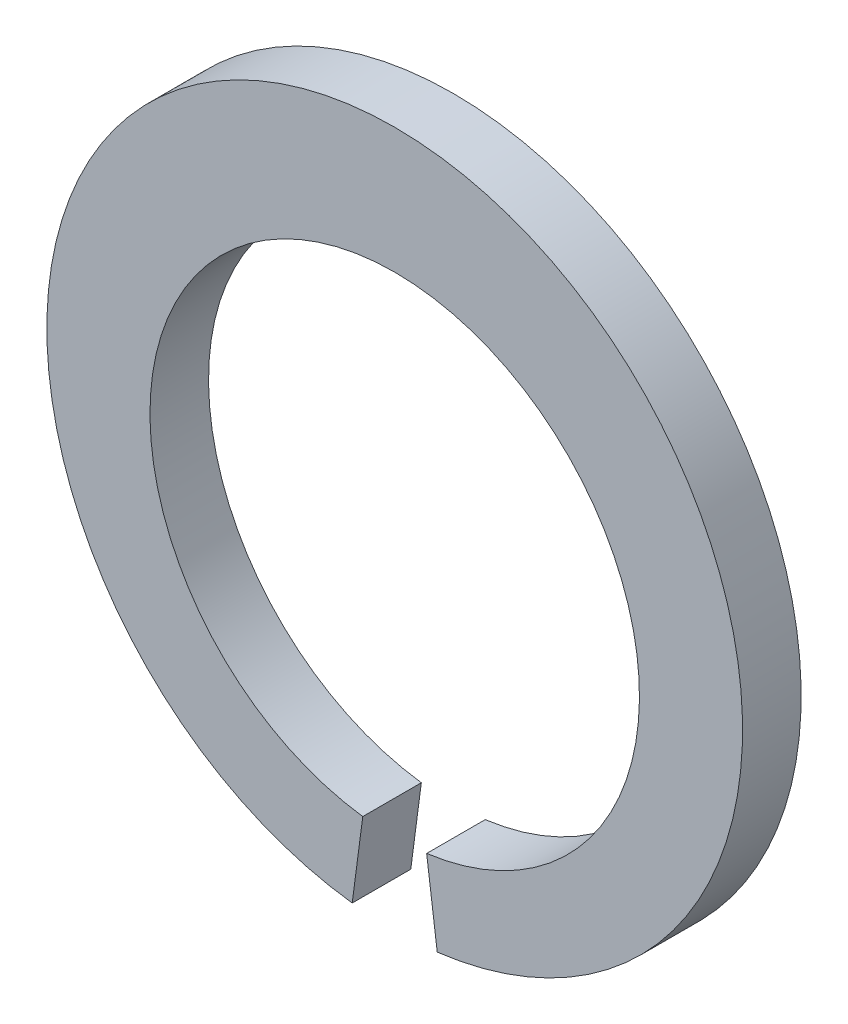
ISO-10303-21;
HEADER;
FILE_DESCRIPTION(('STEP AP214'),'2;1');
FILE_NAME('part.step','',(''),(''),'','','');
FILE_SCHEMA(('AUTOMOTIVE_DESIGN { 1 0 10303 214 1 1 1 1 }'));
ENDSEC;
DATA;
#1=APPLICATION_CONTEXT('core data for automotive mechanical design processes');
#2=APPLICATION_PROTOCOL_DEFINITION('international standard','automotive_design',2000,#1);
#3=PRODUCT_CONTEXT('',#1,'mechanical');
#4=PRODUCT('Part','Part','',(#3));
#5=PRODUCT_RELATED_PRODUCT_CATEGORY('part','',(#4));
#6=PRODUCT_DEFINITION_FORMATION('','',#4);
#7=PRODUCT_DEFINITION_CONTEXT('part definition',#1,'design');
#8=PRODUCT_DEFINITION('design','',#6,#7);
#9=PRODUCT_DEFINITION_SHAPE('','',#8);
#10=(LENGTH_UNIT() NAMED_UNIT(*) SI_UNIT(.MILLI.,.METRE.));
#11=(NAMED_UNIT(*) PLANE_ANGLE_UNIT() SI_UNIT($,.RADIAN.));
#12=(NAMED_UNIT(*) SI_UNIT($,.STERADIAN.) SOLID_ANGLE_UNIT());
#13=UNCERTAINTY_MEASURE_WITH_UNIT(LENGTH_MEASURE(1.E-05),#10,'distance_accuracy_value','');
#14=(GEOMETRIC_REPRESENTATION_CONTEXT(3) GLOBAL_UNCERTAINTY_ASSIGNED_CONTEXT((#13)) GLOBAL_UNIT_ASSIGNED_CONTEXT((#10,
#11,#12)) REPRESENTATION_CONTEXT('',''));
#15=CARTESIAN_POINT('',(0.,0.,0.));
#16=DIRECTION('',(0.,0.,1.));
#17=DIRECTION('',(1.,0.,0.));
#18=AXIS2_PLACEMENT_3D('',#15,#16,#17);
#19=CARTESIAN_POINT('',(0.,0.,-1.0668));
#20=DIRECTION('',(0.,0.,1.));
#21=DIRECTION('',(1.,0.,0.));
#22=AXIS2_PLACEMENT_3D('',#19,#20,#21);
#23=CYLINDRICAL_SURFACE('',#22,4.4577);
#24=CARTESIAN_POINT('',(0.,0.,0.));
#25=DIRECTION('',(0.,0.,-1.));
#26=DIRECTION('',(1.,0.,0.));
#27=AXIS2_PLACEMENT_3D('',#24,#25,#26);
#28=CIRCLE('',#27,4.4577);
#29=CARTESIAN_POINT('',(-0.581846607059326,-4.41956375854603,0.));
#30=VERTEX_POINT('',#29);
#31=CARTESIAN_POINT('',(0.581846607059326,-4.41956375854603,0.));
#32=VERTEX_POINT('',#31);
#33=EDGE_CURVE('E96',#30,#32,#28,.T.);
#34=ORIENTED_EDGE('',*,*,#33,.F.);
#35=DIRECTION('',(0.,0.,1.));
#36=VECTOR('',#35,1.);
#37=CARTESIAN_POINT('',(-0.581846607059326,-4.41956375854603,-1.0668));
#38=LINE('',#37,#36);
#39=CARTESIAN_POINT('',(-0.581846607059326,-4.41956375854603,-1.0668));
#40=VERTEX_POINT('',#39);
#41=EDGE_CURVE('E11',#40,#30,#38,.T.);
#42=ORIENTED_EDGE('',*,*,#41,.F.);
#43=CARTESIAN_POINT('',(0.,0.,-1.0668));
#44=DIRECTION('',(0.,0.,-1.));
#45=DIRECTION('',(1.,0.,0.));
#46=AXIS2_PLACEMENT_3D('',#43,#44,#45);
#47=CIRCLE('',#46,4.4577);
#48=CARTESIAN_POINT('',(0.581846607059326,-4.41956375854603,-1.0668));
#49=VERTEX_POINT('',#48);
#50=EDGE_CURVE('E90',#40,#49,#47,.T.);
#51=ORIENTED_EDGE('',*,*,#50,.T.);
#52=DIRECTION('',(0.,0.,1.));
#53=VECTOR('',#52,1.);
#54=CARTESIAN_POINT('',(0.581846607059326,-4.41956375854603,-1.0668));
#55=LINE('',#54,#53);
#56=EDGE_CURVE('E35',#49,#32,#55,.T.);
#57=ORIENTED_EDGE('',*,*,#56,.T.);
#58=EDGE_LOOP('',(#34,#42,#51,#57));
#59=FACE_BOUND('',#58,.T.);
#60=ADVANCED_FACE('F32',(#59),#23,.F.);
#61=CARTESIAN_POINT('',(-0.581846607059326,-4.41956375854603,-1.0668));
#62=DIRECTION('',(0.99144486137381,-0.130526192220052,0.));
#63=DIRECTION('',(0.130526192220052,0.99144486137381,0.));
#64=AXIS2_PLACEMENT_3D('',#61,#62,#63);
#65=PLANE('',#64);
#66=DIRECTION('',(0.130526192220052,0.99144486137381,0.));
#67=VECTOR('',#66,1.);
#68=CARTESIAN_POINT('',(-0.581846607059326,-4.41956375854603,0.));
#69=LINE('',#68,#67);
#70=CARTESIAN_POINT('',(-0.774137793437907,-5.88016032832193,0.));
#71=VERTEX_POINT('',#70);
#72=EDGE_CURVE('E92',#71,#30,#69,.T.);
#73=ORIENTED_EDGE('',*,*,#72,.F.);
#74=DIRECTION('',(0.,0.,1.));
#75=VECTOR('',#74,1.);
#76=CARTESIAN_POINT('',(-0.774137793437907,-5.88016032832193,-1.0668));
#77=LINE('',#76,#75);
#78=CARTESIAN_POINT('',(-0.774137793437907,-5.88016032832193,-1.0668));
#79=VERTEX_POINT('',#78);
#80=EDGE_CURVE('E41',#79,#71,#77,.T.);
#81=ORIENTED_EDGE('',*,*,#80,.F.);
#82=DIRECTION('',(0.130526192220052,0.99144486137381,0.));
#83=VECTOR('',#82,1.);
#84=CARTESIAN_POINT('',(-0.581846607059326,-4.41956375854603,-1.0668));
#85=LINE('',#84,#83);
#86=EDGE_CURVE('E87',#79,#40,#85,.T.);
#87=ORIENTED_EDGE('',*,*,#86,.T.);
#88=ORIENTED_EDGE('',*,*,#41,.T.);
#89=EDGE_LOOP('',(#73,#81,#87,#88));
#90=FACE_BOUND('',#89,.T.);
#91=ADVANCED_FACE('F106',(#90),#65,.T.);
#92=CARTESIAN_POINT('',(0.,0.408033462509381,-1.0668));
#93=DIRECTION('',(0.,0.,1.));
#94=DIRECTION('',(1.,0.,0.));
#95=AXIS2_PLACEMENT_3D('',#92,#93,#94);
#96=CYLINDRICAL_SURFACE('',#95,6.33566653749062);
#97=CARTESIAN_POINT('',(0.,0.408033462509381,0.));
#98=DIRECTION('',(0.,0.,1.));
#99=DIRECTION('',(1.,0.,0.));
#100=AXIS2_PLACEMENT_3D('',#97,#98,#99);
#101=CIRCLE('',#100,6.33566653749062);
#102=CARTESIAN_POINT('',(0.774137793437907,-5.88016032832193,0.));
#103=VERTEX_POINT('',#102);
#104=EDGE_CURVE('E82',#103,#71,#101,.T.);
#105=ORIENTED_EDGE('',*,*,#104,.F.);
#106=DIRECTION('',(0.,0.,1.));
#107=VECTOR('',#106,1.);
#108=CARTESIAN_POINT('',(0.774137793437907,-5.88016032832193,-1.0668));
#109=LINE('',#108,#107);
#110=CARTESIAN_POINT('',(0.774137793437907,-5.88016032832193,-1.0668));
#111=VERTEX_POINT('',#110);
#112=EDGE_CURVE('E77',#111,#103,#109,.T.);
#113=ORIENTED_EDGE('',*,*,#112,.F.);
#114=CARTESIAN_POINT('',(0.,0.408033462509381,-1.0668));
#115=DIRECTION('',(0.,0.,1.));
#116=DIRECTION('',(1.,0.,0.));
#117=AXIS2_PLACEMENT_3D('',#114,#115,#116);
#118=CIRCLE('',#117,6.33566653749062);
#119=EDGE_CURVE('E80',#111,#79,#118,.T.);
#120=ORIENTED_EDGE('',*,*,#119,.T.);
#121=ORIENTED_EDGE('',*,*,#80,.T.);
#122=EDGE_LOOP('',(#105,#113,#120,#121));
#123=FACE_BOUND('',#122,.T.);
#124=ADVANCED_FACE('F79',(#123),#96,.T.);
#125=CARTESIAN_POINT('',(0.581846607059326,-4.41956375854603,-1.0668));
#126=DIRECTION('',(-0.99144486137381,-0.130526192220052,0.));
#127=DIRECTION('',(0.130526192220052,-0.99144486137381,0.));
#128=AXIS2_PLACEMENT_3D('',#125,#126,#127);
#129=PLANE('',#128);
#130=DIRECTION('',(0.130526192220052,-0.99144486137381,0.));
#131=VECTOR('',#130,1.);
#132=CARTESIAN_POINT('',(0.581846607059326,-4.41956375854603,0.));
#133=LINE('',#132,#131);
#134=EDGE_CURVE('E99',#32,#103,#133,.T.);
#135=ORIENTED_EDGE('',*,*,#134,.F.);
#136=ORIENTED_EDGE('',*,*,#56,.F.);
#137=DIRECTION('',(0.130526192220052,-0.99144486137381,0.));
#138=VECTOR('',#137,1.);
#139=CARTESIAN_POINT('',(0.581846607059326,-4.41956375854603,-1.0668));
#140=LINE('',#139,#138);
#141=EDGE_CURVE('E86',#49,#111,#140,.T.);
#142=ORIENTED_EDGE('',*,*,#141,.T.);
#143=ORIENTED_EDGE('',*,*,#112,.T.);
#144=EDGE_LOOP('',(#135,#136,#142,#143));
#145=FACE_BOUND('',#144,.T.);
#146=ADVANCED_FACE('F89',(#145),#129,.T.);
#147=CARTESIAN_POINT('',(0.,0.,-1.0668));
#148=DIRECTION('',(0.,0.,1.));
#149=DIRECTION('',(1.,0.,0.));
#150=AXIS2_PLACEMENT_3D('',#147,#148,#149);
#151=PLANE('',#150);
#152=ORIENTED_EDGE('',*,*,#50,.F.);
#153=ORIENTED_EDGE('',*,*,#86,.F.);
#154=ORIENTED_EDGE('',*,*,#119,.F.);
#155=ORIENTED_EDGE('',*,*,#141,.F.);
#156=EDGE_LOOP('',(#152,#153,#154,#155));
#157=FACE_BOUND('',#156,.T.);
#158=ADVANCED_FACE('F85',(#157),#151,.F.);
#159=CARTESIAN_POINT('',(0.,0.,0.));
#160=DIRECTION('',(0.,0.,1.));
#161=DIRECTION('',(1.,0.,0.));
#162=AXIS2_PLACEMENT_3D('',#159,#160,#161);
#163=PLANE('',#162);
#164=ORIENTED_EDGE('',*,*,#33,.T.);
#165=ORIENTED_EDGE('',*,*,#134,.T.);
#166=ORIENTED_EDGE('',*,*,#104,.T.);
#167=ORIENTED_EDGE('',*,*,#72,.T.);
#168=EDGE_LOOP('',(#164,#165,#166,#167));
#169=FACE_BOUND('',#168,.T.);
#170=ADVANCED_FACE('F105',(#169),#163,.T.);
#171=CLOSED_SHELL('',(#60,#91,#124,#146,#158,#170));
#172=MANIFOLD_SOLID_BREP('B2',#171);
#173=ADVANCED_BREP_SHAPE_REPRESENTATION('',(#18,#172),#14);
#174=SHAPE_DEFINITION_REPRESENTATION(#9,#173);
ENDSEC;
END-ISO-10303-21;
